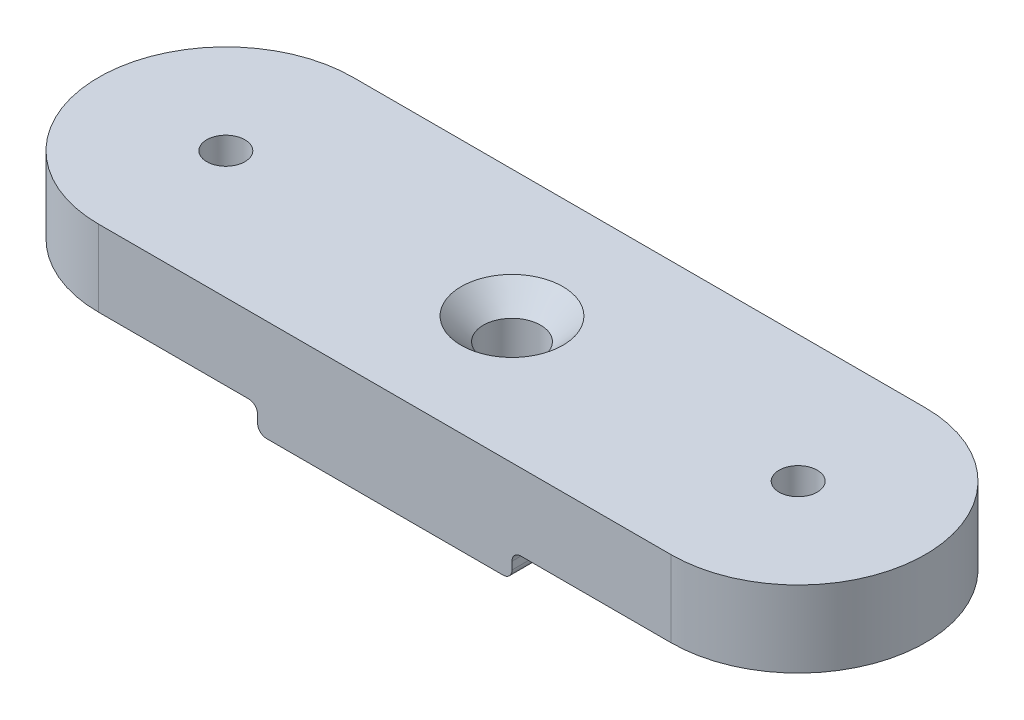
ISO-10303-21;
HEADER;
FILE_DESCRIPTION(('STEP AP214'),'2;1');
FILE_NAME('part.step','',(''),(''),'','','');
FILE_SCHEMA(('AUTOMOTIVE_DESIGN { 1 0 10303 214 1 1 1 1 }'));
ENDSEC;
DATA;
#1=APPLICATION_CONTEXT('core data for automotive mechanical design processes');
#2=APPLICATION_PROTOCOL_DEFINITION('international standard','automotive_design',2000,#1);
#3=PRODUCT_CONTEXT('',#1,'mechanical');
#4=PRODUCT('Part','Part','',(#3));
#5=PRODUCT_RELATED_PRODUCT_CATEGORY('part','',(#4));
#6=PRODUCT_DEFINITION_FORMATION('','',#4);
#7=PRODUCT_DEFINITION_CONTEXT('part definition',#1,'design');
#8=PRODUCT_DEFINITION('design','',#6,#7);
#9=PRODUCT_DEFINITION_SHAPE('','',#8);
#10=(LENGTH_UNIT() NAMED_UNIT(*) SI_UNIT(.MILLI.,.METRE.));
#11=(NAMED_UNIT(*) PLANE_ANGLE_UNIT() SI_UNIT($,.RADIAN.));
#12=(NAMED_UNIT(*) SI_UNIT($,.STERADIAN.) SOLID_ANGLE_UNIT());
#13=UNCERTAINTY_MEASURE_WITH_UNIT(LENGTH_MEASURE(1.E-05),#10,'distance_accuracy_value','');
#14=(GEOMETRIC_REPRESENTATION_CONTEXT(3) GLOBAL_UNCERTAINTY_ASSIGNED_CONTEXT((#13)) GLOBAL_UNIT_ASSIGNED_CONTEXT((#10,
#11,#12)) REPRESENTATION_CONTEXT('',''));
#15=CARTESIAN_POINT('',(0.,0.,0.));
#16=DIRECTION('',(0.,0.,1.));
#17=DIRECTION('',(1.,0.,0.));
#18=AXIS2_PLACEMENT_3D('',#15,#16,#17);
#19=CARTESIAN_POINT('',(-22.5,8.,0.));
#20=DIRECTION('',(0.,-1.,0.));
#21=DIRECTION('',(0.,0.,-1.));
#22=AXIS2_PLACEMENT_3D('',#19,#20,#21);
#23=CYLINDRICAL_SURFACE('',#22,1.5);
#24=CARTESIAN_POINT('',(-22.5,8.,0.));
#25=DIRECTION('',(0.,1.,0.));
#26=DIRECTION('',(0.,0.,1.));
#27=AXIS2_PLACEMENT_3D('',#24,#25,#26);
#28=CIRCLE('',#27,1.5);
#29=CARTESIAN_POINT('',(-22.5,8.,1.5));
#30=VERTEX_POINT('',#29);
#31=EDGE_CURVE('E318',#30,#30,#28,.T.);
#32=ORIENTED_EDGE('',*,*,#31,.T.);
#33=EDGE_LOOP('',(#32));
#34=FACE_BOUND('',#33,.T.);
#35=CARTESIAN_POINT('',(-22.5,5.,0.));
#36=DIRECTION('',(0.,-1.,0.));
#37=DIRECTION('',(0.,0.,-1.));
#38=AXIS2_PLACEMENT_3D('',#35,#36,#37);
#39=CIRCLE('',#38,1.5);
#40=CARTESIAN_POINT('',(-22.5,5.,-1.5));
#41=VERTEX_POINT('',#40);
#42=EDGE_CURVE('E176',#41,#41,#39,.T.);
#43=ORIENTED_EDGE('',*,*,#42,.T.);
#44=EDGE_LOOP('',(#43));
#45=FACE_BOUND('',#44,.T.);
#46=ADVANCED_FACE('F41',(#34,#45),#23,.F.);
#47=CARTESIAN_POINT('',(22.5,8.,0.));
#48=DIRECTION('',(0.,-1.,0.));
#49=DIRECTION('',(0.,0.,-1.));
#50=AXIS2_PLACEMENT_3D('',#47,#48,#49);
#51=CYLINDRICAL_SURFACE('',#50,1.5);
#52=CARTESIAN_POINT('',(22.5,8.,0.));
#53=DIRECTION('',(0.,1.,0.));
#54=DIRECTION('',(0.,0.,1.));
#55=AXIS2_PLACEMENT_3D('',#52,#53,#54);
#56=CIRCLE('',#55,1.5);
#57=CARTESIAN_POINT('',(22.5,8.,1.5));
#58=VERTEX_POINT('',#57);
#59=EDGE_CURVE('E315',#58,#58,#56,.T.);
#60=ORIENTED_EDGE('',*,*,#59,.T.);
#61=EDGE_LOOP('',(#60));
#62=FACE_BOUND('',#61,.T.);
#63=CARTESIAN_POINT('',(22.5,5.,0.));
#64=DIRECTION('',(0.,-1.,0.));
#65=DIRECTION('',(0.,0.,-1.));
#66=AXIS2_PLACEMENT_3D('',#63,#64,#65);
#67=CIRCLE('',#66,1.5);
#68=CARTESIAN_POINT('',(22.5,5.,-1.5));
#69=VERTEX_POINT('',#68);
#70=EDGE_CURVE('E173',#69,#69,#67,.T.);
#71=ORIENTED_EDGE('',*,*,#70,.T.);
#72=EDGE_LOOP('',(#71));
#73=FACE_BOUND('',#72,.T.);
#74=ADVANCED_FACE('F232',(#62,#73),#51,.F.);
#75=CARTESIAN_POINT('',(-22.5,8.,0.));
#76=DIRECTION('',(0.,1.,0.));
#77=DIRECTION('',(0.,0.,1.));
#78=AXIS2_PLACEMENT_3D('',#75,#76,#77);
#79=PLANE('',#78);
#80=CARTESIAN_POINT('',(0.,8.,0.));
#81=DIRECTION('',(0.,1.,0.));
#82=DIRECTION('',(0.,0.,1.));
#83=AXIS2_PLACEMENT_3D('',#80,#81,#82);
#84=CIRCLE('',#83,4.);
#85=CARTESIAN_POINT('',(0.,8.,4.));
#86=VERTEX_POINT('',#85);
#87=EDGE_CURVE('E163',#86,#86,#84,.F.);
#88=ORIENTED_EDGE('',*,*,#87,.T.);
#89=EDGE_LOOP('',(#88));
#90=FACE_BOUND('',#89,.T.);
#91=ORIENTED_EDGE('',*,*,#59,.F.);
#92=EDGE_LOOP('',(#91));
#93=FACE_BOUND('',#92,.T.);
#94=CARTESIAN_POINT('',(-22.5,8.,0.));
#95=DIRECTION('',(0.,1.,0.));
#96=DIRECTION('',(0.,0.,1.));
#97=AXIS2_PLACEMENT_3D('',#94,#95,#96);
#98=CIRCLE('',#97,10.);
#99=CARTESIAN_POINT('',(-22.5,8.,-10.));
#100=VERTEX_POINT('',#99);
#101=CARTESIAN_POINT('',(-22.5,8.,10.));
#102=VERTEX_POINT('',#101);
#103=EDGE_CURVE('E321',#100,#102,#98,.T.);
#104=ORIENTED_EDGE('',*,*,#103,.T.);
#105=DIRECTION('',(1.,0.,0.));
#106=VECTOR('',#105,1.);
#107=CARTESIAN_POINT('',(-22.5,8.,10.));
#108=LINE('',#107,#106);
#109=CARTESIAN_POINT('',(22.5,8.,10.));
#110=VERTEX_POINT('',#109);
#111=EDGE_CURVE('E157',#102,#110,#108,.T.);
#112=ORIENTED_EDGE('',*,*,#111,.T.);
#113=CARTESIAN_POINT('',(22.5,8.,0.));
#114=DIRECTION('',(0.,1.,0.));
#115=DIRECTION('',(0.,0.,1.));
#116=AXIS2_PLACEMENT_3D('',#113,#114,#115);
#117=CIRCLE('',#116,10.);
#118=CARTESIAN_POINT('',(22.5,8.,-10.));
#119=VERTEX_POINT('',#118);
#120=EDGE_CURVE('E325',#110,#119,#117,.T.);
#121=ORIENTED_EDGE('',*,*,#120,.T.);
#122=DIRECTION('',(-1.,0.,0.));
#123=VECTOR('',#122,1.);
#124=CARTESIAN_POINT('',(-22.5,8.,-10.));
#125=LINE('',#124,#123);
#126=EDGE_CURVE('E327',#119,#100,#125,.T.);
#127=ORIENTED_EDGE('',*,*,#126,.T.);
#128=EDGE_LOOP('',(#104,#112,#121,#127));
#129=FACE_BOUND('',#128,.T.);
#130=ORIENTED_EDGE('',*,*,#31,.F.);
#131=EDGE_LOOP('',(#130));
#132=FACE_BOUND('',#131,.T.);
#133=ADVANCED_FACE('F239',(#90,#93,#129,#132),#79,.T.);
#134=CARTESIAN_POINT('',(-22.5,0.,0.));
#135=DIRECTION('',(0.,1.,0.));
#136=DIRECTION('',(0.,0.,1.));
#137=AXIS2_PLACEMENT_3D('',#134,#135,#136);
#138=PLANE('',#137);
#139=DIRECTION('',(-1.,0.,0.));
#140=VECTOR('',#139,1.);
#141=CARTESIAN_POINT('',(-22.5,0.,-10.));
#142=LINE('',#141,#140);
#143=CARTESIAN_POINT('',(9.29999999999999,0.,-10.));
#144=VERTEX_POINT('',#143);
#145=CARTESIAN_POINT('',(-9.30000000000001,0.,-10.));
#146=VERTEX_POINT('',#145);
#147=EDGE_CURVE('E323',#144,#146,#142,.T.);
#148=ORIENTED_EDGE('',*,*,#147,.F.);
#149=DIRECTION('',(0.,0.,-1.));
#150=VECTOR('',#149,1.);
#151=CARTESIAN_POINT('',(9.3,0.,0.));
#152=LINE('',#151,#150);
#153=CARTESIAN_POINT('',(9.29999999999999,0.,10.));
#154=VERTEX_POINT('',#153);
#155=EDGE_CURVE('E191',#144,#154,#152,.F.);
#156=ORIENTED_EDGE('',*,*,#155,.T.);
#157=DIRECTION('',(1.,0.,0.));
#158=VECTOR('',#157,1.);
#159=CARTESIAN_POINT('',(-22.5,0.,10.));
#160=LINE('',#159,#158);
#161=CARTESIAN_POINT('',(-9.30000000000001,0.,10.));
#162=VERTEX_POINT('',#161);
#163=EDGE_CURVE('E320',#162,#154,#160,.T.);
#164=ORIENTED_EDGE('',*,*,#163,.F.);
#165=DIRECTION('',(0.,0.,1.));
#166=VECTOR('',#165,1.);
#167=CARTESIAN_POINT('',(-9.3,0.,0.));
#168=LINE('',#167,#166);
#169=EDGE_CURVE('E189',#162,#146,#168,.F.);
#170=ORIENTED_EDGE('',*,*,#169,.T.);
#171=EDGE_LOOP('',(#148,#156,#164,#170));
#172=FACE_BOUND('',#171,.T.);
#173=CARTESIAN_POINT('',(0.,0.,0.));
#174=DIRECTION('',(0.,1.,0.));
#175=DIRECTION('',(0.,0.,1.));
#176=AXIS2_PLACEMENT_3D('',#173,#174,#175);
#177=CIRCLE('',#176,2.25);
#178=CARTESIAN_POINT('',(0.,0.,2.25));
#179=VERTEX_POINT('',#178);
#180=EDGE_CURVE('E303',#179,#179,#177,.T.);
#181=ORIENTED_EDGE('',*,*,#180,.T.);
#182=EDGE_LOOP('',(#181));
#183=FACE_BOUND('',#182,.T.);
#184=ADVANCED_FACE('F248',(#172,#183),#138,.F.);
#185=CARTESIAN_POINT('',(-22.5,8.,0.));
#186=DIRECTION('',(0.,-1.,0.));
#187=DIRECTION('',(0.,0.,-1.));
#188=AXIS2_PLACEMENT_3D('',#185,#186,#187);
#189=CYLINDRICAL_SURFACE('',#188,10.);
#190=DIRECTION('',(0.,-1.,0.));
#191=VECTOR('',#190,1.);
#192=CARTESIAN_POINT('',(-22.5,8.,-10.));
#193=LINE('',#192,#191);
#194=CARTESIAN_POINT('',(-22.5,2.,-10.));
#195=VERTEX_POINT('',#194);
#196=EDGE_CURVE('E151',#100,#195,#193,.T.);
#197=ORIENTED_EDGE('',*,*,#196,.T.);
#198=CARTESIAN_POINT('',(-22.5,2.,0.));
#199=DIRECTION('',(0.,1.,0.));
#200=DIRECTION('',(0.,0.,1.));
#201=AXIS2_PLACEMENT_3D('',#198,#199,#200);
#202=CIRCLE('',#201,10.);
#203=CARTESIAN_POINT('',(-22.5,2.,10.));
#204=VERTEX_POINT('',#203);
#205=EDGE_CURVE('E137',#204,#195,#202,.F.);
#206=ORIENTED_EDGE('',*,*,#205,.F.);
#207=DIRECTION('',(0.,-1.,0.));
#208=VECTOR('',#207,1.);
#209=CARTESIAN_POINT('',(-22.5,8.,10.));
#210=LINE('',#209,#208);
#211=EDGE_CURVE('E149',#102,#204,#210,.T.);
#212=ORIENTED_EDGE('',*,*,#211,.F.);
#213=ORIENTED_EDGE('',*,*,#103,.F.);
#214=EDGE_LOOP('',(#197,#206,#212,#213));
#215=FACE_BOUND('',#214,.T.);
#216=ADVANCED_FACE('F147',(#215),#189,.T.);
#217=CARTESIAN_POINT('',(-22.5,8.,10.));
#218=DIRECTION('',(0.,0.,-1.));
#219=DIRECTION('',(-1.,0.,0.));
#220=AXIS2_PLACEMENT_3D('',#217,#218,#219);
#221=PLANE('',#220);
#222=ORIENTED_EDGE('',*,*,#163,.T.);
#223=CARTESIAN_POINT('',(9.3,0.699999999999999,10.));
#224=DIRECTION('',(0.,0.,-1.));
#225=DIRECTION('',(-1.,0.,0.));
#226=AXIS2_PLACEMENT_3D('',#223,#224,#225);
#227=CIRCLE('',#226,0.7);
#228=CARTESIAN_POINT('',(10.,0.699999999999999,10.));
#229=VERTEX_POINT('',#228);
#230=EDGE_CURVE('E194',#154,#229,#227,.F.);
#231=ORIENTED_EDGE('',*,*,#230,.T.);
#232=DIRECTION('',(0.,-1.,0.));
#233=VECTOR('',#232,1.);
#234=CARTESIAN_POINT('',(10.,38.1039864469807,10.));
#235=LINE('',#234,#233);
#236=CARTESIAN_POINT('',(10.,1.3,10.));
#237=VERTEX_POINT('',#236);
#238=EDGE_CURVE('E305',#237,#229,#235,.T.);
#239=ORIENTED_EDGE('',*,*,#238,.F.);
#240=CARTESIAN_POINT('',(10.7,1.3,10.));
#241=DIRECTION('',(0.,0.,-1.));
#242=DIRECTION('',(-1.,0.,0.));
#243=AXIS2_PLACEMENT_3D('',#240,#241,#242);
#244=CIRCLE('',#243,0.7);
#245=CARTESIAN_POINT('',(10.7,2.,10.));
#246=VERTEX_POINT('',#245);
#247=EDGE_CURVE('E56',#237,#246,#244,.T.);
#248=ORIENTED_EDGE('',*,*,#247,.T.);
#249=DIRECTION('',(-1.,0.,0.));
#250=VECTOR('',#249,1.);
#251=CARTESIAN_POINT('',(22.5,2.,10.));
#252=LINE('',#251,#250);
#253=CARTESIAN_POINT('',(22.5,2.,10.));
#254=VERTEX_POINT('',#253);
#255=EDGE_CURVE('E180',#254,#246,#252,.T.);
#256=ORIENTED_EDGE('',*,*,#255,.F.);
#257=DIRECTION('',(0.,-1.,0.));
#258=VECTOR('',#257,1.);
#259=CARTESIAN_POINT('',(22.5,8.,10.));
#260=LINE('',#259,#258);
#261=EDGE_CURVE('E160',#110,#254,#260,.T.);
#262=ORIENTED_EDGE('',*,*,#261,.F.);
#263=ORIENTED_EDGE('',*,*,#111,.F.);
#264=ORIENTED_EDGE('',*,*,#211,.T.);
#265=DIRECTION('',(-1.,0.,0.));
#266=VECTOR('',#265,1.);
#267=CARTESIAN_POINT('',(-10.,2.,10.));
#268=LINE('',#267,#266);
#269=CARTESIAN_POINT('',(-10.7,2.,10.));
#270=VERTEX_POINT('',#269);
#271=EDGE_CURVE('E133',#270,#204,#268,.T.);
#272=ORIENTED_EDGE('',*,*,#271,.F.);
#273=CARTESIAN_POINT('',(-10.7,1.3,10.));
#274=DIRECTION('',(0.,0.,-1.));
#275=DIRECTION('',(-1.,0.,0.));
#276=AXIS2_PLACEMENT_3D('',#273,#274,#275);
#277=CIRCLE('',#276,0.7);
#278=CARTESIAN_POINT('',(-10.,1.3,10.));
#279=VERTEX_POINT('',#278);
#280=EDGE_CURVE('E207',#270,#279,#277,.T.);
#281=ORIENTED_EDGE('',*,*,#280,.T.);
#282=DIRECTION('',(0.,-1.,0.));
#283=VECTOR('',#282,1.);
#284=CARTESIAN_POINT('',(-10.,38.1039864469807,10.));
#285=LINE('',#284,#283);
#286=CARTESIAN_POINT('',(-10.,0.699999999999999,10.));
#287=VERTEX_POINT('',#286);
#288=EDGE_CURVE('E297',#279,#287,#285,.T.);
#289=ORIENTED_EDGE('',*,*,#288,.T.);
#290=CARTESIAN_POINT('',(-9.3,0.699999999999999,10.));
#291=DIRECTION('',(0.,0.,-1.));
#292=DIRECTION('',(-1.,0.,0.));
#293=AXIS2_PLACEMENT_3D('',#290,#291,#292);
#294=CIRCLE('',#293,0.7);
#295=EDGE_CURVE('E64',#287,#162,#294,.F.);
#296=ORIENTED_EDGE('',*,*,#295,.T.);
#297=EDGE_LOOP('',(#222,#231,#239,#248,#256,#262,#263,#264,#272,#281,#289,#296));
#298=FACE_BOUND('',#297,.T.);
#299=ADVANCED_FACE('F155',(#298),#221,.F.);
#300=CARTESIAN_POINT('',(22.5,8.,0.));
#301=DIRECTION('',(0.,-1.,0.));
#302=DIRECTION('',(0.,0.,-1.));
#303=AXIS2_PLACEMENT_3D('',#300,#301,#302);
#304=CYLINDRICAL_SURFACE('',#303,10.);
#305=ORIENTED_EDGE('',*,*,#261,.T.);
#306=CARTESIAN_POINT('',(22.5,2.,0.));
#307=DIRECTION('',(0.,1.,0.));
#308=DIRECTION('',(0.,0.,1.));
#309=AXIS2_PLACEMENT_3D('',#306,#307,#308);
#310=CIRCLE('',#309,10.);
#311=CARTESIAN_POINT('',(22.5,2.,-10.));
#312=VERTEX_POINT('',#311);
#313=EDGE_CURVE('E142',#312,#254,#310,.F.);
#314=ORIENTED_EDGE('',*,*,#313,.F.);
#315=DIRECTION('',(0.,-1.,0.));
#316=VECTOR('',#315,1.);
#317=CARTESIAN_POINT('',(22.5,8.,-10.));
#318=LINE('',#317,#316);
#319=EDGE_CURVE('E166',#119,#312,#318,.T.);
#320=ORIENTED_EDGE('',*,*,#319,.F.);
#321=ORIENTED_EDGE('',*,*,#120,.F.);
#322=EDGE_LOOP('',(#305,#314,#320,#321));
#323=FACE_BOUND('',#322,.T.);
#324=ADVANCED_FACE('F257',(#323),#304,.T.);
#325=CARTESIAN_POINT('',(-22.5,8.,-10.));
#326=DIRECTION('',(0.,0.,1.));
#327=DIRECTION('',(1.,0.,0.));
#328=AXIS2_PLACEMENT_3D('',#325,#326,#327);
#329=PLANE('',#328);
#330=DIRECTION('',(0.,-1.,0.));
#331=VECTOR('',#330,1.);
#332=CARTESIAN_POINT('',(10.,38.1039864469807,-10.));
#333=LINE('',#332,#331);
#334=CARTESIAN_POINT('',(10.,1.3,-10.));
#335=VERTEX_POINT('',#334);
#336=CARTESIAN_POINT('',(10.,0.699999999999999,-10.));
#337=VERTEX_POINT('',#336);
#338=EDGE_CURVE('E309',#335,#337,#333,.T.);
#339=ORIENTED_EDGE('',*,*,#338,.T.);
#340=CARTESIAN_POINT('',(9.3,0.699999999999999,-10.));
#341=DIRECTION('',(0.,0.,1.));
#342=DIRECTION('',(1.,0.,0.));
#343=AXIS2_PLACEMENT_3D('',#340,#341,#342);
#344=CIRCLE('',#343,0.7);
#345=EDGE_CURVE('E187',#337,#144,#344,.F.);
#346=ORIENTED_EDGE('',*,*,#345,.T.);
#347=ORIENTED_EDGE('',*,*,#147,.T.);
#348=CARTESIAN_POINT('',(-9.3,0.699999999999999,-10.));
#349=DIRECTION('',(0.,0.,1.));
#350=DIRECTION('',(1.,0.,0.));
#351=AXIS2_PLACEMENT_3D('',#348,#349,#350);
#352=CIRCLE('',#351,0.7);
#353=CARTESIAN_POINT('',(-10.,0.699999999999999,-10.));
#354=VERTEX_POINT('',#353);
#355=EDGE_CURVE('E185',#146,#354,#352,.F.);
#356=ORIENTED_EDGE('',*,*,#355,.T.);
#357=DIRECTION('',(0.,-1.,0.));
#358=VECTOR('',#357,1.);
#359=CARTESIAN_POINT('',(-10.,38.1039864469807,-10.));
#360=LINE('',#359,#358);
#361=CARTESIAN_POINT('',(-10.,1.3,-10.));
#362=VERTEX_POINT('',#361);
#363=EDGE_CURVE('E295',#362,#354,#360,.T.);
#364=ORIENTED_EDGE('',*,*,#363,.F.);
#365=CARTESIAN_POINT('',(-10.7,1.3,-10.));
#366=DIRECTION('',(0.,0.,1.));
#367=DIRECTION('',(1.,0.,0.));
#368=AXIS2_PLACEMENT_3D('',#365,#366,#367);
#369=CIRCLE('',#368,0.7);
#370=CARTESIAN_POINT('',(-10.7,2.,-10.));
#371=VERTEX_POINT('',#370);
#372=EDGE_CURVE('E209',#362,#371,#369,.T.);
#373=ORIENTED_EDGE('',*,*,#372,.T.);
#374=DIRECTION('',(1.,0.,0.));
#375=VECTOR('',#374,1.);
#376=CARTESIAN_POINT('',(-22.5,2.,-10.));
#377=LINE('',#376,#375);
#378=EDGE_CURVE('E152',#195,#371,#377,.T.);
#379=ORIENTED_EDGE('',*,*,#378,.F.);
#380=ORIENTED_EDGE('',*,*,#196,.F.);
#381=ORIENTED_EDGE('',*,*,#126,.F.);
#382=ORIENTED_EDGE('',*,*,#319,.T.);
#383=DIRECTION('',(1.,0.,0.));
#384=VECTOR('',#383,1.);
#385=CARTESIAN_POINT('',(10.,2.,-10.));
#386=LINE('',#385,#384);
#387=CARTESIAN_POINT('',(10.7,2.,-10.));
#388=VERTEX_POINT('',#387);
#389=EDGE_CURVE('E307',#388,#312,#386,.T.);
#390=ORIENTED_EDGE('',*,*,#389,.F.);
#391=CARTESIAN_POINT('',(10.7,1.3,-10.));
#392=DIRECTION('',(0.,0.,1.));
#393=DIRECTION('',(1.,0.,0.));
#394=AXIS2_PLACEMENT_3D('',#391,#392,#393);
#395=CIRCLE('',#394,0.7);
#396=EDGE_CURVE('E204',#388,#335,#395,.T.);
#397=ORIENTED_EDGE('',*,*,#396,.T.);
#398=EDGE_LOOP('',(#339,#346,#347,#356,#364,#373,#379,#380,#381,#382,#390,#397));
#399=FACE_BOUND('',#398,.T.);
#400=ADVANCED_FACE('F253',(#399),#329,.F.);
#401=CARTESIAN_POINT('',(0.,8.,0.));
#402=DIRECTION('',(0.,-1.,0.));
#403=DIRECTION('',(0.,0.,-1.));
#404=AXIS2_PLACEMENT_3D('',#401,#402,#403);
#405=CYLINDRICAL_SURFACE('',#404,2.25);
#406=CARTESIAN_POINT('',(0.,6.25,0.));
#407=DIRECTION('',(0.,1.,0.));
#408=DIRECTION('',(0.,0.,1.));
#409=AXIS2_PLACEMENT_3D('',#406,#407,#408);
#410=CIRCLE('',#409,2.25);
#411=CARTESIAN_POINT('',(0.,6.25,2.25));
#412=VERTEX_POINT('',#411);
#413=EDGE_CURVE('E159',#412,#412,#410,.T.);
#414=ORIENTED_EDGE('',*,*,#413,.T.);
#415=EDGE_LOOP('',(#414));
#416=FACE_BOUND('',#415,.T.);
#417=ORIENTED_EDGE('',*,*,#180,.F.);
#418=EDGE_LOOP('',(#417));
#419=FACE_BOUND('',#418,.T.);
#420=ADVANCED_FACE('F256',(#416,#419),#405,.F.);
#421=CARTESIAN_POINT('',(0.,6.25,0.));
#422=DIRECTION('',(0.,1.,0.));
#423=DIRECTION('',(0.,0.,1.));
#424=AXIS2_PLACEMENT_3D('',#421,#422,#423);
#425=CONICAL_SURFACE('',#424,2.25,0.78539816339745);
#426=CARTESIAN_POINT('',(0.,8.,4.));
#427=CARTESIAN_POINT('',(0.,7.98177083333333,3.98177083333334));
#428=CARTESIAN_POINT('',(0.,7.96354166666667,3.96354166666667));
#429=CARTESIAN_POINT('',(0.,7.92708333333333,3.92708333333334));
#430=CARTESIAN_POINT('',(0.,7.90885416666666,3.90885416666667));
#431=CARTESIAN_POINT('',(0.,7.87239583333333,3.87239583333334));
#432=CARTESIAN_POINT('',(0.,7.85416666666667,3.85416666666667));
#433=CARTESIAN_POINT('',(0.,7.81770833333333,3.81770833333334));
#434=CARTESIAN_POINT('',(0.,7.79947916666667,3.79947916666667));
#435=CARTESIAN_POINT('',(0.,7.76302083333333,3.76302083333334));
#436=CARTESIAN_POINT('',(0.,7.74479166666667,3.74479166666667));
#437=CARTESIAN_POINT('',(0.,7.70833333333333,3.70833333333334));
#438=CARTESIAN_POINT('',(0.,7.69010416666667,3.69010416666667));
#439=CARTESIAN_POINT('',(0.,7.65364583333333,3.65364583333334));
#440=CARTESIAN_POINT('',(0.,7.63541666666667,3.63541666666667));
#441=CARTESIAN_POINT('',(0.,7.59895833333333,3.59895833333333));
#442=CARTESIAN_POINT('',(0.,7.58072916666667,3.58072916666667));
#443=CARTESIAN_POINT('',(0.,7.54427083333333,3.54427083333333));
#444=CARTESIAN_POINT('',(0.,7.52604166666667,3.52604166666667));
#445=CARTESIAN_POINT('',(0.,7.48958333333333,3.48958333333333));
#446=CARTESIAN_POINT('',(0.,7.47135416666667,3.47135416666667));
#447=CARTESIAN_POINT('',(0.,7.43489583333333,3.43489583333333));
#448=CARTESIAN_POINT('',(0.,7.41666666666667,3.41666666666667));
#449=CARTESIAN_POINT('',(0.,7.38020833333333,3.38020833333333));
#450=CARTESIAN_POINT('',(0.,7.36197916666667,3.36197916666667));
#451=CARTESIAN_POINT('',(0.,7.32552083333333,3.32552083333333));
#452=CARTESIAN_POINT('',(0.,7.30729166666667,3.30729166666667));
#453=CARTESIAN_POINT('',(0.,7.27083333333333,3.27083333333333));
#454=CARTESIAN_POINT('',(0.,7.25260416666667,3.25260416666667));
#455=CARTESIAN_POINT('',(0.,7.21614583333333,3.21614583333333));
#456=CARTESIAN_POINT('',(0.,7.19791666666667,3.19791666666667));
#457=CARTESIAN_POINT('',(0.,7.16145833333333,3.16145833333333));
#458=CARTESIAN_POINT('',(0.,7.14322916666667,3.14322916666667));
#459=CARTESIAN_POINT('',(0.,7.10677083333333,3.10677083333333));
#460=CARTESIAN_POINT('',(0.,7.08854166666667,3.08854166666667));
#461=CARTESIAN_POINT('',(0.,7.05208333333333,3.05208333333333));
#462=CARTESIAN_POINT('',(0.,7.03385416666667,3.03385416666667));
#463=CARTESIAN_POINT('',(0.,6.99739583333333,2.99739583333333));
#464=CARTESIAN_POINT('',(0.,6.97916666666667,2.97916666666667));
#465=CARTESIAN_POINT('',(0.,6.94270833333333,2.94270833333333));
#466=CARTESIAN_POINT('',(0.,6.92447916666667,2.92447916666667));
#467=CARTESIAN_POINT('',(0.,6.88802083333333,2.88802083333333));
#468=CARTESIAN_POINT('',(0.,6.86979166666667,2.86979166666667));
#469=CARTESIAN_POINT('',(0.,6.83333333333333,2.83333333333333));
#470=CARTESIAN_POINT('',(0.,6.81510416666667,2.81510416666667));
#471=CARTESIAN_POINT('',(0.,6.77864583333333,2.77864583333333));
#472=CARTESIAN_POINT('',(0.,6.76041666666667,2.76041666666667));
#473=CARTESIAN_POINT('',(0.,6.72395833333333,2.72395833333333));
#474=CARTESIAN_POINT('',(0.,6.70572916666667,2.70572916666667));
#475=CARTESIAN_POINT('',(0.,6.66927083333333,2.66927083333333));
#476=CARTESIAN_POINT('',(0.,6.65104166666667,2.65104166666667));
#477=CARTESIAN_POINT('',(0.,6.61458333333333,2.61458333333333));
#478=CARTESIAN_POINT('',(0.,6.59635416666667,2.59635416666667));
#479=CARTESIAN_POINT('',(0.,6.55989583333333,2.55989583333333));
#480=CARTESIAN_POINT('',(0.,6.54166666666667,2.54166666666667));
#481=CARTESIAN_POINT('',(0.,6.50520833333333,2.50520833333333));
#482=CARTESIAN_POINT('',(0.,6.48697916666667,2.48697916666667));
#483=CARTESIAN_POINT('',(0.,6.45052083333333,2.45052083333333));
#484=CARTESIAN_POINT('',(0.,6.43229166666667,2.43229166666667));
#485=CARTESIAN_POINT('',(0.,6.39583333333333,2.39583333333333));
#486=CARTESIAN_POINT('',(0.,6.37760416666667,2.37760416666667));
#487=CARTESIAN_POINT('',(0.,6.34114583333333,2.34114583333333));
#488=CARTESIAN_POINT('',(0.,6.32291666666667,2.32291666666667));
#489=CARTESIAN_POINT('',(0.,6.28645833333333,2.28645833333333));
#490=CARTESIAN_POINT('',(0.,6.26822916666667,2.26822916666667));
#491=CARTESIAN_POINT('',(0.,6.25,2.25));
#492=B_SPLINE_CURVE_WITH_KNOTS('',3,(#426,#427,#428,#429,#430,#431,#432,#433,#434,#435,#436,
#437,#438,#439,#440,#441,#442,#443,#444,#445,#446,#447,#448,#449,#450,#451,#452,#453,#454,#455,
#456,#457,#458,#459,#460,#461,#462,#463,#464,#465,#466,#467,#468,#469,#470,#471,#472,#473,#474,
#475,#476,#477,#478,#479,#480,#481,#482,#483,#484,#485,#486,#487,#488,#489,#490,#491),
.UNSPECIFIED.,.F.,.F.,(4,2,2,2,2,2,2,2,2,2,2,2,2,2,2,2,2,2,2,2,2,2,2,2,2,2,2,2,2,2,2,2,4),(0.,
0.0773398041922781,0.154679608384557,0.232019412576836,0.309359216769115,0.386699020961393,
0.464038825153672,0.541378629345951,0.61871843353823,0.696058237730508,0.773398041922786,
0.850737846115065,0.928077650307344,1.00541745449962,1.0827572586919,1.16009706288418,
1.23743686707646,1.31477667126874,1.39211647546102,1.4694562796533,1.54679608384557,
1.62413588803785,1.70147569223013,1.77881549642241,1.85615530061469,1.93349510480697,
2.01083490899925,2.08817471319153,2.1655145173838,2.24285432157608,2.32019412576836,
2.39753392996064,2.47487373415292),.UNSPECIFIED.);
#493=EDGE_CURVE('BSEAM266',#86,#412,#492,.T.);
#494=ORIENTED_EDGE('',*,*,#87,.F.);
#495=ORIENTED_EDGE('',*,*,#413,.F.);
#496=ORIENTED_EDGE('',*,*,#493,.T.);
#497=ORIENTED_EDGE('',*,*,#493,.F.);
#498=EDGE_LOOP('',(#494,#496,#495,#497));
#499=FACE_BOUND('',#498,.T.);
#500=ADVANCED_FACE('F266',(#499),#425,.F.);
#501=CARTESIAN_POINT('',(-22.5,2.,0.));
#502=DIRECTION('',(0.,1.,0.));
#503=DIRECTION('',(0.,0.,1.));
#504=AXIS2_PLACEMENT_3D('',#501,#502,#503);
#505=PLANE('',#504);
#506=CARTESIAN_POINT('',(22.5,2.,0.));
#507=DIRECTION('',(0.,1.,0.));
#508=DIRECTION('',(0.,0.,1.));
#509=AXIS2_PLACEMENT_3D('',#506,#507,#508);
#510=CIRCLE('',#509,3.5);
#511=CARTESIAN_POINT('',(22.5,2.,3.5));
#512=VERTEX_POINT('',#511);
#513=EDGE_CURVE('E214',#512,#512,#510,.T.);
#514=ORIENTED_EDGE('',*,*,#513,.T.);
#515=EDGE_LOOP('',(#514));
#516=FACE_BOUND('',#515,.T.);
#517=ORIENTED_EDGE('',*,*,#255,.T.);
#518=DIRECTION('',(0.,0.,-1.));
#519=VECTOR('',#518,1.);
#520=CARTESIAN_POINT('',(10.7,2.,-10.));
#521=LINE('',#520,#519);
#522=EDGE_CURVE('E196',#246,#388,#521,.T.);
#523=ORIENTED_EDGE('',*,*,#522,.T.);
#524=ORIENTED_EDGE('',*,*,#389,.T.);
#525=ORIENTED_EDGE('',*,*,#313,.T.);
#526=EDGE_LOOP('',(#517,#523,#524,#525));
#527=FACE_BOUND('',#526,.T.);
#528=ADVANCED_FACE('F271',(#516,#527),#505,.F.);
#529=CARTESIAN_POINT('',(10.,38.1039864469807,-10.));
#530=DIRECTION('',(-1.,0.,0.));
#531=DIRECTION('',(0.,0.,1.));
#532=AXIS2_PLACEMENT_3D('',#529,#530,#531);
#533=PLANE('',#532);
#534=ORIENTED_EDGE('',*,*,#238,.T.);
#535=DIRECTION('',(0.,0.,-1.));
#536=VECTOR('',#535,1.);
#537=CARTESIAN_POINT('',(10.,0.699999999999999,-10.));
#538=LINE('',#537,#536);
#539=EDGE_CURVE('E182',#229,#337,#538,.T.);
#540=ORIENTED_EDGE('',*,*,#539,.T.);
#541=ORIENTED_EDGE('',*,*,#338,.F.);
#542=DIRECTION('',(0.,0.,-1.));
#543=VECTOR('',#542,1.);
#544=CARTESIAN_POINT('',(10.,1.3,10.));
#545=LINE('',#544,#543);
#546=EDGE_CURVE('E172',#335,#237,#545,.F.);
#547=ORIENTED_EDGE('',*,*,#546,.T.);
#548=EDGE_LOOP('',(#534,#540,#541,#547));
#549=FACE_BOUND('',#548,.T.);
#550=ADVANCED_FACE('F343',(#549),#533,.F.);
#551=CARTESIAN_POINT('',(-22.5,2.,0.));
#552=DIRECTION('',(0.,1.,0.));
#553=DIRECTION('',(0.,0.,1.));
#554=AXIS2_PLACEMENT_3D('',#551,#552,#553);
#555=PLANE('',#554);
#556=CARTESIAN_POINT('',(-22.5,2.,0.));
#557=DIRECTION('',(0.,1.,0.));
#558=DIRECTION('',(0.,0.,1.));
#559=AXIS2_PLACEMENT_3D('',#556,#557,#558);
#560=CIRCLE('',#559,3.5);
#561=CARTESIAN_POINT('',(-22.5,2.,3.5));
#562=VERTEX_POINT('',#561);
#563=EDGE_CURVE('E12',#562,#562,#560,.T.);
#564=ORIENTED_EDGE('',*,*,#563,.T.);
#565=EDGE_LOOP('',(#564));
#566=FACE_BOUND('',#565,.T.);
#567=ORIENTED_EDGE('',*,*,#378,.T.);
#568=DIRECTION('',(0.,0.,1.));
#569=VECTOR('',#568,1.);
#570=CARTESIAN_POINT('',(-10.7,2.,10.));
#571=LINE('',#570,#569);
#572=EDGE_CURVE('E140',#371,#270,#571,.T.);
#573=ORIENTED_EDGE('',*,*,#572,.T.);
#574=ORIENTED_EDGE('',*,*,#271,.T.);
#575=ORIENTED_EDGE('',*,*,#205,.T.);
#576=EDGE_LOOP('',(#567,#573,#574,#575));
#577=FACE_BOUND('',#576,.T.);
#578=ADVANCED_FACE('F136',(#566,#577),#555,.F.);
#579=CARTESIAN_POINT('',(-10.,38.1039864469807,-10.));
#580=DIRECTION('',(1.,0.,0.));
#581=DIRECTION('',(0.,0.,-1.));
#582=AXIS2_PLACEMENT_3D('',#579,#580,#581);
#583=PLANE('',#582);
#584=ORIENTED_EDGE('',*,*,#363,.T.);
#585=DIRECTION('',(0.,0.,1.));
#586=VECTOR('',#585,1.);
#587=CARTESIAN_POINT('',(-10.,0.699999999999999,-10.));
#588=LINE('',#587,#586);
#589=EDGE_CURVE('E201',#354,#287,#588,.T.);
#590=ORIENTED_EDGE('',*,*,#589,.T.);
#591=ORIENTED_EDGE('',*,*,#288,.F.);
#592=DIRECTION('',(0.,0.,1.));
#593=VECTOR('',#592,1.);
#594=CARTESIAN_POINT('',(-10.,1.3,-10.));
#595=LINE('',#594,#593);
#596=EDGE_CURVE('E199',#279,#362,#595,.F.);
#597=ORIENTED_EDGE('',*,*,#596,.T.);
#598=EDGE_LOOP('',(#584,#590,#591,#597));
#599=FACE_BOUND('',#598,.T.);
#600=ADVANCED_FACE('F352',(#599),#583,.F.);
#601=CARTESIAN_POINT('',(-22.5,5.,0.));
#602=DIRECTION('',(0.,-1.,0.));
#603=DIRECTION('',(0.,0.,-1.));
#604=AXIS2_PLACEMENT_3D('',#601,#602,#603);
#605=CYLINDRICAL_SURFACE('',#604,3.);
#606=CARTESIAN_POINT('',(-22.5,2.5,0.));
#607=DIRECTION('',(0.,1.,0.));
#608=DIRECTION('',(0.,0.,1.));
#609=AXIS2_PLACEMENT_3D('',#606,#607,#608);
#610=CIRCLE('',#609,3.);
#611=CARTESIAN_POINT('',(-22.5,2.5,3.));
#612=VERTEX_POINT('',#611);
#613=EDGE_CURVE('E49',#612,#612,#610,.F.);
#614=ORIENTED_EDGE('',*,*,#613,.T.);
#615=EDGE_LOOP('',(#614));
#616=FACE_BOUND('',#615,.T.);
#617=CARTESIAN_POINT('',(-22.5,5.,0.));
#618=DIRECTION('',(0.,-1.,0.));
#619=DIRECTION('',(0.,0.,-1.));
#620=AXIS2_PLACEMENT_3D('',#617,#618,#619);
#621=CIRCLE('',#620,3.);
#622=CARTESIAN_POINT('',(-22.5,5.,-3.));
#623=VERTEX_POINT('',#622);
#624=EDGE_CURVE('E177',#623,#623,#621,.T.);
#625=ORIENTED_EDGE('',*,*,#624,.F.);
#626=EDGE_LOOP('',(#625));
#627=FACE_BOUND('',#626,.T.);
#628=ADVANCED_FACE('F219',(#616,#627),#605,.F.);
#629=CARTESIAN_POINT('',(-22.5,5.,0.));
#630=DIRECTION('',(0.,-1.,0.));
#631=DIRECTION('',(0.,0.,-1.));
#632=AXIS2_PLACEMENT_3D('',#629,#630,#631);
#633=PLANE('',#632);
#634=ORIENTED_EDGE('',*,*,#42,.F.);
#635=EDGE_LOOP('',(#634));
#636=FACE_BOUND('',#635,.T.);
#637=ORIENTED_EDGE('',*,*,#624,.T.);
#638=EDGE_LOOP('',(#637));
#639=FACE_BOUND('',#638,.T.);
#640=ADVANCED_FACE('F360',(#636,#639),#633,.T.);
#641=CARTESIAN_POINT('',(22.5,5.,0.));
#642=DIRECTION('',(0.,-1.,0.));
#643=DIRECTION('',(0.,0.,-1.));
#644=AXIS2_PLACEMENT_3D('',#641,#642,#643);
#645=CYLINDRICAL_SURFACE('',#644,3.);
#646=CARTESIAN_POINT('',(22.5,2.5,0.));
#647=DIRECTION('',(0.,1.,0.));
#648=DIRECTION('',(0.,0.,1.));
#649=AXIS2_PLACEMENT_3D('',#646,#647,#648);
#650=CIRCLE('',#649,3.);
#651=CARTESIAN_POINT('',(22.5,2.5,3.));
#652=VERTEX_POINT('',#651);
#653=EDGE_CURVE('E211',#652,#652,#650,.F.);
#654=ORIENTED_EDGE('',*,*,#653,.T.);
#655=EDGE_LOOP('',(#654));
#656=FACE_BOUND('',#655,.T.);
#657=CARTESIAN_POINT('',(22.5,5.,0.));
#658=DIRECTION('',(0.,-1.,0.));
#659=DIRECTION('',(0.,0.,-1.));
#660=AXIS2_PLACEMENT_3D('',#657,#658,#659);
#661=CIRCLE('',#660,3.);
#662=CARTESIAN_POINT('',(22.5,5.,-3.));
#663=VERTEX_POINT('',#662);
#664=EDGE_CURVE('E475',#663,#663,#661,.T.);
#665=ORIENTED_EDGE('',*,*,#664,.F.);
#666=EDGE_LOOP('',(#665));
#667=FACE_BOUND('',#666,.T.);
#668=ADVANCED_FACE('F366',(#656,#667),#645,.F.);
#669=CARTESIAN_POINT('',(22.5,5.,0.));
#670=DIRECTION('',(0.,-1.,0.));
#671=DIRECTION('',(0.,0.,-1.));
#672=AXIS2_PLACEMENT_3D('',#669,#670,#671);
#673=PLANE('',#672);
#674=ORIENTED_EDGE('',*,*,#70,.F.);
#675=EDGE_LOOP('',(#674));
#676=FACE_BOUND('',#675,.T.);
#677=ORIENTED_EDGE('',*,*,#664,.T.);
#678=EDGE_LOOP('',(#677));
#679=FACE_BOUND('',#678,.T.);
#680=ADVANCED_FACE('F277',(#676,#679),#673,.T.);
#681=CARTESIAN_POINT('',(9.3,0.699999999999999,-10.));
#682=DIRECTION('',(0.,0.,-1.));
#683=DIRECTION('',(-1.,0.,0.));
#684=AXIS2_PLACEMENT_3D('',#681,#682,#683);
#685=CYLINDRICAL_SURFACE('',#684,0.7);
#686=ORIENTED_EDGE('',*,*,#230,.F.);
#687=ORIENTED_EDGE('',*,*,#155,.F.);
#688=ORIENTED_EDGE('',*,*,#345,.F.);
#689=ORIENTED_EDGE('',*,*,#539,.F.);
#690=EDGE_LOOP('',(#686,#687,#688,#689));
#691=FACE_BOUND('',#690,.T.);
#692=ADVANCED_FACE('F273',(#691),#685,.T.);
#693=CARTESIAN_POINT('',(10.7,1.3,0.));
#694=DIRECTION('',(0.,0.,1.));
#695=DIRECTION('',(1.,0.,0.));
#696=AXIS2_PLACEMENT_3D('',#693,#694,#695);
#697=CYLINDRICAL_SURFACE('',#696,0.7);
#698=ORIENTED_EDGE('',*,*,#247,.F.);
#699=ORIENTED_EDGE('',*,*,#546,.F.);
#700=ORIENTED_EDGE('',*,*,#396,.F.);
#701=ORIENTED_EDGE('',*,*,#522,.F.);
#702=EDGE_LOOP('',(#698,#699,#700,#701));
#703=FACE_BOUND('',#702,.T.);
#704=ADVANCED_FACE('F276',(#703),#697,.F.);
#705=CARTESIAN_POINT('',(-9.3,0.699999999999999,-10.));
#706=DIRECTION('',(0.,0.,1.));
#707=DIRECTION('',(1.,0.,0.));
#708=AXIS2_PLACEMENT_3D('',#705,#706,#707);
#709=CYLINDRICAL_SURFACE('',#708,0.7);
#710=ORIENTED_EDGE('',*,*,#355,.F.);
#711=ORIENTED_EDGE('',*,*,#169,.F.);
#712=ORIENTED_EDGE('',*,*,#295,.F.);
#713=ORIENTED_EDGE('',*,*,#589,.F.);
#714=EDGE_LOOP('',(#710,#711,#712,#713));
#715=FACE_BOUND('',#714,.T.);
#716=ADVANCED_FACE('F281',(#715),#709,.T.);
#717=CARTESIAN_POINT('',(-10.7,1.3,0.));
#718=DIRECTION('',(0.,0.,-1.));
#719=DIRECTION('',(-1.,0.,0.));
#720=AXIS2_PLACEMENT_3D('',#717,#718,#719);
#721=CYLINDRICAL_SURFACE('',#720,0.7);
#722=ORIENTED_EDGE('',*,*,#372,.F.);
#723=ORIENTED_EDGE('',*,*,#596,.F.);
#724=ORIENTED_EDGE('',*,*,#280,.F.);
#725=ORIENTED_EDGE('',*,*,#572,.F.);
#726=EDGE_LOOP('',(#722,#723,#724,#725));
#727=FACE_BOUND('',#726,.T.);
#728=ADVANCED_FACE('F228',(#727),#721,.F.);
#729=CARTESIAN_POINT('',(22.5,2.5,0.));
#730=DIRECTION('',(0.,1.,0.));
#731=DIRECTION('',(0.,0.,1.));
#732=AXIS2_PLACEMENT_3D('',#729,#730,#731);
#733=TOROIDAL_SURFACE('',#732,3.5,0.5);
#734=ORIENTED_EDGE('',*,*,#513,.F.);
#735=EDGE_LOOP('',(#734));
#736=FACE_BOUND('',#735,.T.);
#737=ORIENTED_EDGE('',*,*,#653,.F.);
#738=EDGE_LOOP('',(#737));
#739=FACE_BOUND('',#738,.T.);
#740=ADVANCED_FACE('F223',(#736,#739),#733,.T.);
#741=CARTESIAN_POINT('',(-22.5,2.5,0.));
#742=DIRECTION('',(0.,1.,0.));
#743=DIRECTION('',(0.,0.,1.));
#744=AXIS2_PLACEMENT_3D('',#741,#742,#743);
#745=TOROIDAL_SURFACE('',#744,3.5,0.5);
#746=ORIENTED_EDGE('',*,*,#563,.F.);
#747=EDGE_LOOP('',(#746));
#748=FACE_BOUND('',#747,.T.);
#749=ORIENTED_EDGE('',*,*,#613,.F.);
#750=EDGE_LOOP('',(#749));
#751=FACE_BOUND('',#750,.T.);
#752=ADVANCED_FACE('F43',(#748,#751),#745,.T.);
#753=CLOSED_SHELL('',(#46,#74,#133,#184,#216,#299,#324,#400,#420,#500,#528,#550,#578,#600,#628,
#640,#668,#680,#692,#704,#716,#728,#740,#752));
#754=MANIFOLD_SOLID_BREP('B2',#753);
#755=ADVANCED_BREP_SHAPE_REPRESENTATION('',(#18,#754),#14);
#756=SHAPE_DEFINITION_REPRESENTATION(#9,#755);
ENDSEC;
END-ISO-10303-21;
